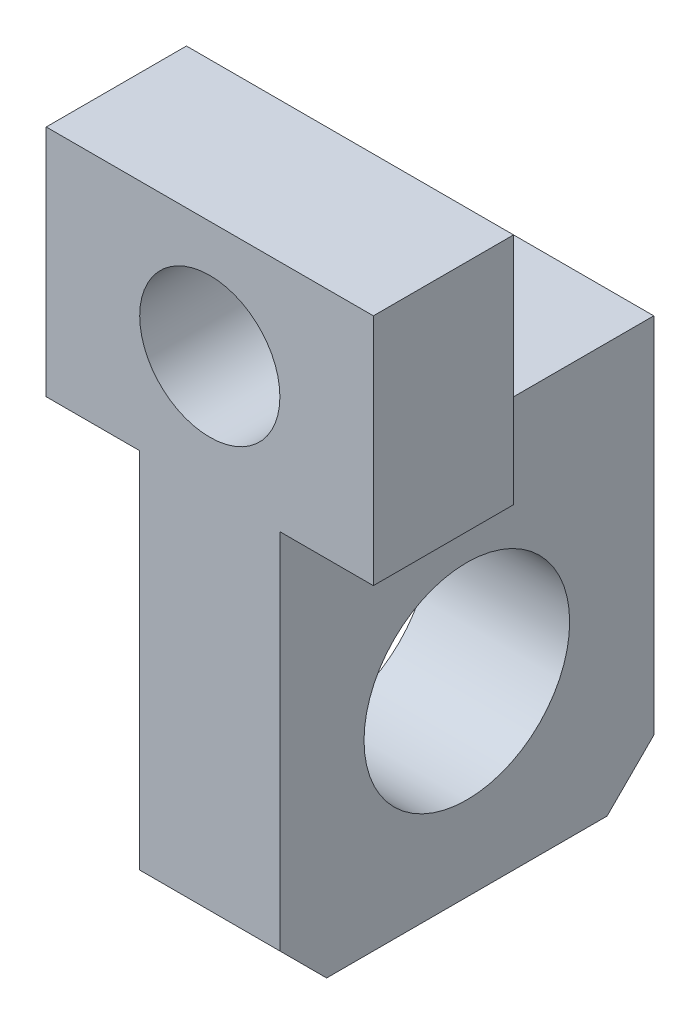
ISO-10303-21;
HEADER;
FILE_DESCRIPTION(('STEP AP214'),'2;1');
FILE_NAME('part.step','',(''),(''),'','','');
FILE_SCHEMA(('AUTOMOTIVE_DESIGN { 1 0 10303 214 1 1 1 1 }'));
ENDSEC;
DATA;
#1=APPLICATION_CONTEXT('core data for automotive mechanical design processes');
#2=APPLICATION_PROTOCOL_DEFINITION('international standard','automotive_design',2000,#1);
#3=PRODUCT_CONTEXT('',#1,'mechanical');
#4=PRODUCT('Part','Part','',(#3));
#5=PRODUCT_RELATED_PRODUCT_CATEGORY('part','',(#4));
#6=PRODUCT_DEFINITION_FORMATION('','',#4);
#7=PRODUCT_DEFINITION_CONTEXT('part definition',#1,'design');
#8=PRODUCT_DEFINITION('design','',#6,#7);
#9=PRODUCT_DEFINITION_SHAPE('','',#8);
#10=(LENGTH_UNIT() NAMED_UNIT(*) SI_UNIT(.MILLI.,.METRE.));
#11=(NAMED_UNIT(*) PLANE_ANGLE_UNIT() SI_UNIT($,.RADIAN.));
#12=(NAMED_UNIT(*) SI_UNIT($,.STERADIAN.) SOLID_ANGLE_UNIT());
#13=UNCERTAINTY_MEASURE_WITH_UNIT(LENGTH_MEASURE(1.E-05),#10,'distance_accuracy_value','');
#14=(GEOMETRIC_REPRESENTATION_CONTEXT(3) GLOBAL_UNCERTAINTY_ASSIGNED_CONTEXT((#13)) GLOBAL_UNIT_ASSIGNED_CONTEXT((#10,
#11,#12)) REPRESENTATION_CONTEXT('',''));
#15=CARTESIAN_POINT('',(0.,0.,0.));
#16=DIRECTION('',(0.,0.,1.));
#17=DIRECTION('',(1.,0.,0.));
#18=AXIS2_PLACEMENT_3D('',#15,#16,#17);
#19=CARTESIAN_POINT('',(0.,11.1387335246286,10.16));
#20=DIRECTION('',(0.,1.,0.));
#21=DIRECTION('',(0.,0.,1.));
#22=AXIS2_PLACEMENT_3D('',#19,#20,#21);
#23=PLANE('',#22);
#24=DIRECTION('',(-1.,0.,0.));
#25=VECTOR('',#24,1.);
#26=CARTESIAN_POINT('',(-6.35,11.1387335246286,6.35));
#27=LINE('',#26,#25);
#28=CARTESIAN_POINT('',(2.54,11.1387335246286,6.35));
#29=VERTEX_POINT('',#28);
#30=CARTESIAN_POINT('',(0.,11.1387335246286,6.35));
#31=VERTEX_POINT('',#30);
#32=EDGE_CURVE('E260',#29,#31,#27,.T.);
#33=ORIENTED_EDGE('',*,*,#32,.F.);
#34=DIRECTION('',(0.,0.,-1.));
#35=VECTOR('',#34,1.);
#36=CARTESIAN_POINT('',(2.54,11.1387335246286,10.16));
#37=LINE('',#36,#35);
#38=CARTESIAN_POINT('',(2.54,11.1387335246286,10.16));
#39=VERTEX_POINT('',#38);
#40=EDGE_CURVE('E167',#39,#29,#37,.T.);
#41=ORIENTED_EDGE('',*,*,#40,.F.);
#42=DIRECTION('',(1.,0.,0.));
#43=VECTOR('',#42,1.);
#44=CARTESIAN_POINT('',(0.,11.1387335246286,10.16));
#45=LINE('',#44,#43);
#46=CARTESIAN_POINT('',(0.,11.1387335246286,10.16));
#47=VERTEX_POINT('',#46);
#48=EDGE_CURVE('E287',#47,#39,#45,.T.);
#49=ORIENTED_EDGE('',*,*,#48,.F.);
#50=DIRECTION('',(0.,0.,-1.));
#51=VECTOR('',#50,1.);
#52=CARTESIAN_POINT('',(0.,11.1387335246286,10.16));
#53=LINE('',#52,#51);
#54=EDGE_CURVE('E176',#47,#31,#53,.T.);
#55=ORIENTED_EDGE('',*,*,#54,.T.);
#56=EDGE_LOOP('',(#33,#41,#49,#55));
#57=FACE_BOUND('',#56,.T.);
#58=ADVANCED_FACE('F47',(#57),#23,.F.);
#59=CARTESIAN_POINT('',(2.54,11.1387335246286,10.16));
#60=DIRECTION('',(-1.,0.,0.));
#61=DIRECTION('',(0.,-1.,0.));
#62=AXIS2_PLACEMENT_3D('',#59,#60,#61);
#63=PLANE('',#62);
#64=DIRECTION('',(0.,-1.,0.));
#65=VECTOR('',#64,1.);
#66=CARTESIAN_POINT('',(2.54,11.1387335246286,6.35));
#67=LINE('',#66,#65);
#68=CARTESIAN_POINT('',(2.54,17.4887335246286,6.35));
#69=VERTEX_POINT('',#68);
#70=EDGE_CURVE('E158',#69,#29,#67,.T.);
#71=ORIENTED_EDGE('',*,*,#70,.F.);
#72=DIRECTION('',(0.,0.,-1.));
#73=VECTOR('',#72,1.);
#74=CARTESIAN_POINT('',(2.54,17.4887335246286,10.16));
#75=LINE('',#74,#73);
#76=CARTESIAN_POINT('',(2.54,17.4887335246286,10.16));
#77=VERTEX_POINT('',#76);
#78=EDGE_CURVE('E156',#77,#69,#75,.T.);
#79=ORIENTED_EDGE('',*,*,#78,.F.);
#80=DIRECTION('',(0.,1.,0.));
#81=VECTOR('',#80,1.);
#82=CARTESIAN_POINT('',(2.54,11.1387335246286,10.16));
#83=LINE('',#82,#81);
#84=EDGE_CURVE('E290',#39,#77,#83,.T.);
#85=ORIENTED_EDGE('',*,*,#84,.F.);
#86=ORIENTED_EDGE('',*,*,#40,.T.);
#87=EDGE_LOOP('',(#71,#79,#85,#86));
#88=FACE_BOUND('',#87,.T.);
#89=ADVANCED_FACE('F302',(#88),#63,.F.);
#90=CARTESIAN_POINT('',(2.54,17.4887335246286,10.16));
#91=DIRECTION('',(0.,-1.,0.));
#92=DIRECTION('',(0.,0.,-1.));
#93=AXIS2_PLACEMENT_3D('',#90,#91,#92);
#94=PLANE('',#93);
#95=DIRECTION('',(1.,0.,0.));
#96=VECTOR('',#95,1.);
#97=CARTESIAN_POINT('',(-6.35,17.4887335246286,6.35));
#98=LINE('',#97,#96);
#99=CARTESIAN_POINT('',(-6.35,17.4887335246286,6.35));
#100=VERTEX_POINT('',#99);
#101=EDGE_CURVE('E136',#100,#69,#98,.T.);
#102=ORIENTED_EDGE('',*,*,#101,.F.);
#103=DIRECTION('',(0.,0.,-1.));
#104=VECTOR('',#103,1.);
#105=CARTESIAN_POINT('',(-6.35,17.4887335246286,10.16));
#106=LINE('',#105,#104);
#107=CARTESIAN_POINT('',(-6.35,17.4887335246286,10.16));
#108=VERTEX_POINT('',#107);
#109=EDGE_CURVE('E153',#108,#100,#106,.T.);
#110=ORIENTED_EDGE('',*,*,#109,.F.);
#111=DIRECTION('',(-1.,0.,0.));
#112=VECTOR('',#111,1.);
#113=CARTESIAN_POINT('',(2.54,17.4887335246286,10.16));
#114=LINE('',#113,#112);
#115=EDGE_CURVE('E293',#77,#108,#114,.T.);
#116=ORIENTED_EDGE('',*,*,#115,.F.);
#117=ORIENTED_EDGE('',*,*,#78,.T.);
#118=EDGE_LOOP('',(#102,#110,#116,#117));
#119=FACE_BOUND('',#118,.T.);
#120=ADVANCED_FACE('F151',(#119),#94,.F.);
#121=CARTESIAN_POINT('',(-6.35,17.4887335246286,10.16));
#122=DIRECTION('',(1.,0.,0.));
#123=DIRECTION('',(0.,0.,-1.));
#124=AXIS2_PLACEMENT_3D('',#121,#122,#123);
#125=PLANE('',#124);
#126=DIRECTION('',(0.,1.,0.));
#127=VECTOR('',#126,1.);
#128=CARTESIAN_POINT('',(-6.35,11.1387335246286,6.35));
#129=LINE('',#128,#127);
#130=CARTESIAN_POINT('',(-6.35,11.1387335246286,6.35));
#131=VERTEX_POINT('',#130);
#132=EDGE_CURVE('E133',#131,#100,#129,.T.);
#133=ORIENTED_EDGE('',*,*,#132,.F.);
#134=DIRECTION('',(0.,0.,-1.));
#135=VECTOR('',#134,1.);
#136=CARTESIAN_POINT('',(-6.35,11.1387335246286,10.16));
#137=LINE('',#136,#135);
#138=CARTESIAN_POINT('',(-6.35,11.1387335246286,10.16));
#139=VERTEX_POINT('',#138);
#140=EDGE_CURVE('E163',#139,#131,#137,.T.);
#141=ORIENTED_EDGE('',*,*,#140,.F.);
#142=DIRECTION('',(0.,-1.,0.));
#143=VECTOR('',#142,1.);
#144=CARTESIAN_POINT('',(-6.35,17.4887335246286,10.16));
#145=LINE('',#144,#143);
#146=EDGE_CURVE('E161',#108,#139,#145,.T.);
#147=ORIENTED_EDGE('',*,*,#146,.F.);
#148=ORIENTED_EDGE('',*,*,#109,.T.);
#149=EDGE_LOOP('',(#133,#141,#147,#148));
#150=FACE_BOUND('',#149,.T.);
#151=ADVANCED_FACE('F160',(#150),#125,.F.);
#152=CARTESIAN_POINT('',(-6.35,11.1387335246286,10.16));
#153=DIRECTION('',(0.,1.,0.));
#154=DIRECTION('',(0.,0.,1.));
#155=AXIS2_PLACEMENT_3D('',#152,#153,#154);
#156=PLANE('',#155);
#157=CARTESIAN_POINT('',(-3.81,11.1387335246286,6.35));
#158=VERTEX_POINT('',#157);
#159=EDGE_CURVE('E140',#158,#131,#27,.T.);
#160=ORIENTED_EDGE('',*,*,#159,.F.);
#161=DIRECTION('',(0.,0.,-1.));
#162=VECTOR('',#161,1.);
#163=CARTESIAN_POINT('',(-3.81,11.1387335246286,10.16));
#164=LINE('',#163,#162);
#165=CARTESIAN_POINT('',(-3.81,11.1387335246286,10.16));
#166=VERTEX_POINT('',#165);
#167=EDGE_CURVE('E169',#166,#158,#164,.T.);
#168=ORIENTED_EDGE('',*,*,#167,.F.);
#169=DIRECTION('',(1.,0.,0.));
#170=VECTOR('',#169,1.);
#171=CARTESIAN_POINT('',(-6.35,11.1387335246286,10.16));
#172=LINE('',#171,#170);
#173=EDGE_CURVE('E219',#139,#166,#172,.T.);
#174=ORIENTED_EDGE('',*,*,#173,.F.);
#175=ORIENTED_EDGE('',*,*,#140,.T.);
#176=EDGE_LOOP('',(#160,#168,#174,#175));
#177=FACE_BOUND('',#176,.T.);
#178=ADVANCED_FACE('F264',(#177),#156,.F.);
#179=CARTESIAN_POINT('',(-1.905,14.3137335246286,10.16));
#180=DIRECTION('',(0.,0.,-1.));
#181=DIRECTION('',(-1.,0.,0.));
#182=AXIS2_PLACEMENT_3D('',#179,#180,#181);
#183=CYLINDRICAL_SURFACE('',#182,1.905);
#184=CARTESIAN_POINT('',(-1.905,14.3137335246286,10.16));
#185=DIRECTION('',(0.,0.,1.));
#186=DIRECTION('',(1.,0.,0.));
#187=AXIS2_PLACEMENT_3D('',#184,#185,#186);
#188=CIRCLE('',#187,1.905);
#189=CARTESIAN_POINT('',(0.,14.3137335246286,10.16));
#190=VERTEX_POINT('',#189);
#191=EDGE_CURVE('E240',#190,#190,#188,.T.);
#192=ORIENTED_EDGE('',*,*,#191,.T.);
#193=EDGE_LOOP('',(#192));
#194=FACE_BOUND('',#193,.T.);
#195=CARTESIAN_POINT('',(-1.905,14.3137335246286,6.35));
#196=DIRECTION('',(0.,0.,-1.));
#197=DIRECTION('',(-1.,0.,0.));
#198=AXIS2_PLACEMENT_3D('',#195,#196,#197);
#199=CIRCLE('',#198,1.905);
#200=CARTESIAN_POINT('',(-3.81,14.3137335246286,6.35));
#201=VERTEX_POINT('',#200);
#202=EDGE_CURVE('E52',#201,#201,#199,.T.);
#203=ORIENTED_EDGE('',*,*,#202,.T.);
#204=EDGE_LOOP('',(#203));
#205=FACE_BOUND('',#204,.T.);
#206=ADVANCED_FACE('F337',(#194,#205),#183,.F.);
#207=CARTESIAN_POINT('',(0.,0.,10.16));
#208=DIRECTION('',(0.,0.,-1.));
#209=DIRECTION('',(-1.,0.,0.));
#210=AXIS2_PLACEMENT_3D('',#207,#208,#209);
#211=PLANE('',#210);
#212=DIRECTION('',(0.,-1.,0.));
#213=VECTOR('',#212,1.);
#214=CARTESIAN_POINT('',(-3.81,0.,10.16));
#215=LINE('',#214,#213);
#216=CARTESIAN_POINT('',(-3.81,1.27,10.16));
#217=VERTEX_POINT('',#216);
#218=EDGE_CURVE('E209',#166,#217,#215,.T.);
#219=ORIENTED_EDGE('',*,*,#218,.T.);
#220=DIRECTION('',(1.,0.,0.));
#221=VECTOR('',#220,1.);
#222=CARTESIAN_POINT('',(0.,1.27,10.16));
#223=LINE('',#222,#221);
#224=CARTESIAN_POINT('',(0.,1.27,10.16));
#225=VERTEX_POINT('',#224);
#226=EDGE_CURVE('E184',#217,#225,#223,.T.);
#227=ORIENTED_EDGE('',*,*,#226,.T.);
#228=DIRECTION('',(0.,1.,0.));
#229=VECTOR('',#228,1.);
#230=CARTESIAN_POINT('',(0.,0.,10.16));
#231=LINE('',#230,#229);
#232=EDGE_CURVE('E228',#225,#47,#231,.T.);
#233=ORIENTED_EDGE('',*,*,#232,.T.);
#234=ORIENTED_EDGE('',*,*,#48,.T.);
#235=ORIENTED_EDGE('',*,*,#84,.T.);
#236=ORIENTED_EDGE('',*,*,#115,.T.);
#237=ORIENTED_EDGE('',*,*,#146,.T.);
#238=ORIENTED_EDGE('',*,*,#173,.T.);
#239=EDGE_LOOP('',(#219,#227,#233,#234,#235,#236,#237,#238));
#240=FACE_BOUND('',#239,.T.);
#241=ORIENTED_EDGE('',*,*,#191,.F.);
#242=EDGE_LOOP('',(#241));
#243=FACE_BOUND('',#242,.T.);
#244=ADVANCED_FACE('F215',(#240,#243),#211,.F.);
#245=CARTESIAN_POINT('',(0.,0.,0.));
#246=DIRECTION('',(0.,0.,-1.));
#247=DIRECTION('',(-1.,0.,0.));
#248=AXIS2_PLACEMENT_3D('',#245,#246,#247);
#249=PLANE('',#248);
#250=DIRECTION('',(-1.,0.,0.));
#251=VECTOR('',#250,1.);
#252=CARTESIAN_POINT('',(-6.35,11.1387335246286,0.));
#253=LINE('',#252,#251);
#254=CARTESIAN_POINT('',(0.,11.1387335246286,0.));
#255=VERTEX_POINT('',#254);
#256=CARTESIAN_POINT('',(-3.81,11.1387335246286,0.));
#257=VERTEX_POINT('',#256);
#258=EDGE_CURVE('E146',#255,#257,#253,.T.);
#259=ORIENTED_EDGE('',*,*,#258,.F.);
#260=DIRECTION('',(0.,1.,0.));
#261=VECTOR('',#260,1.);
#262=CARTESIAN_POINT('',(0.,0.,0.));
#263=LINE('',#262,#261);
#264=CARTESIAN_POINT('',(0.,1.27,0.));
#265=VERTEX_POINT('',#264);
#266=EDGE_CURVE('E235',#265,#255,#263,.T.);
#267=ORIENTED_EDGE('',*,*,#266,.F.);
#268=DIRECTION('',(-1.,0.,0.));
#269=VECTOR('',#268,1.);
#270=CARTESIAN_POINT('',(-3.81,1.27,0.));
#271=LINE('',#270,#269);
#272=CARTESIAN_POINT('',(-3.81,1.27,0.));
#273=VERTEX_POINT('',#272);
#274=EDGE_CURVE('E11',#265,#273,#271,.T.);
#275=ORIENTED_EDGE('',*,*,#274,.T.);
#276=DIRECTION('',(0.,-1.,0.));
#277=VECTOR('',#276,1.);
#278=CARTESIAN_POINT('',(-3.81,0.,0.));
#279=LINE('',#278,#277);
#280=EDGE_CURVE('E239',#257,#273,#279,.T.);
#281=ORIENTED_EDGE('',*,*,#280,.F.);
#282=EDGE_LOOP('',(#259,#267,#275,#281));
#283=FACE_BOUND('',#282,.T.);
#284=ADVANCED_FACE('F237',(#283),#249,.T.);
#285=CARTESIAN_POINT('',(0.,0.,10.16));
#286=DIRECTION('',(0.,1.,0.));
#287=DIRECTION('',(0.,0.,1.));
#288=AXIS2_PLACEMENT_3D('',#285,#286,#287);
#289=PLANE('',#288);
#290=DIRECTION('',(0.,0.,-1.));
#291=VECTOR('',#290,1.);
#292=CARTESIAN_POINT('',(0.,0.,10.16));
#293=LINE('',#292,#291);
#294=CARTESIAN_POINT('',(0.,0.,8.89));
#295=VERTEX_POINT('',#294);
#296=CARTESIAN_POINT('',(0.,0.,1.27));
#297=VERTEX_POINT('',#296);
#298=EDGE_CURVE('E180',#295,#297,#293,.T.);
#299=ORIENTED_EDGE('',*,*,#298,.F.);
#300=DIRECTION('',(-1.,0.,0.));
#301=VECTOR('',#300,1.);
#302=CARTESIAN_POINT('',(0.,0.,8.89));
#303=LINE('',#302,#301);
#304=CARTESIAN_POINT('',(-3.81,0.,8.89));
#305=VERTEX_POINT('',#304);
#306=EDGE_CURVE('E198',#295,#305,#303,.T.);
#307=ORIENTED_EDGE('',*,*,#306,.T.);
#308=DIRECTION('',(0.,0.,-1.));
#309=VECTOR('',#308,1.);
#310=CARTESIAN_POINT('',(-3.81,0.,10.16));
#311=LINE('',#310,#309);
#312=CARTESIAN_POINT('',(-3.81,0.,1.27));
#313=VERTEX_POINT('',#312);
#314=EDGE_CURVE('E210',#305,#313,#311,.T.);
#315=ORIENTED_EDGE('',*,*,#314,.T.);
#316=DIRECTION('',(1.,0.,0.));
#317=VECTOR('',#316,1.);
#318=CARTESIAN_POINT('',(0.,0.,1.27));
#319=LINE('',#318,#317);
#320=EDGE_CURVE('E194',#313,#297,#319,.T.);
#321=ORIENTED_EDGE('',*,*,#320,.T.);
#322=EDGE_LOOP('',(#299,#307,#315,#321));
#323=FACE_BOUND('',#322,.T.);
#324=ADVANCED_FACE('F230',(#323),#289,.F.);
#325=CARTESIAN_POINT('',(0.,0.,10.16));
#326=DIRECTION('',(-1.,0.,0.));
#327=DIRECTION('',(0.,0.,1.));
#328=AXIS2_PLACEMENT_3D('',#325,#326,#327);
#329=PLANE('',#328);
#330=CARTESIAN_POINT('',(0.,5.08,5.08));
#331=DIRECTION('',(1.,0.,0.));
#332=DIRECTION('',(0.,0.,-1.));
#333=AXIS2_PLACEMENT_3D('',#330,#331,#332);
#334=CIRCLE('',#333,2.794);
#335=CARTESIAN_POINT('',(0.,5.08,2.286));
#336=VERTEX_POINT('',#335);
#337=EDGE_CURVE('E276',#336,#336,#334,.T.);
#338=ORIENTED_EDGE('',*,*,#337,.F.);
#339=EDGE_LOOP('',(#338));
#340=FACE_BOUND('',#339,.T.);
#341=ORIENTED_EDGE('',*,*,#232,.F.);
#342=DIRECTION('',(0.,0.707106781186546,0.707106781186549));
#343=VECTOR('',#342,1.);
#344=CARTESIAN_POINT('',(0.,1.27,10.16));
#345=LINE('',#344,#343);
#346=EDGE_CURVE('E191',#225,#295,#345,.F.);
#347=ORIENTED_EDGE('',*,*,#346,.T.);
#348=ORIENTED_EDGE('',*,*,#298,.T.);
#349=DIRECTION('',(0.,0.707106781186549,-0.707106781186546));
#350=VECTOR('',#349,1.);
#351=CARTESIAN_POINT('',(0.,0.,1.27));
#352=LINE('',#351,#350);
#353=EDGE_CURVE('E188',#297,#265,#352,.T.);
#354=ORIENTED_EDGE('',*,*,#353,.T.);
#355=ORIENTED_EDGE('',*,*,#266,.T.);
#356=DIRECTION('',(0.,0.,1.));
#357=VECTOR('',#356,1.);
#358=CARTESIAN_POINT('',(0.,11.1387335246286,10.16));
#359=LINE('',#358,#357);
#360=EDGE_CURVE('E272',#255,#31,#359,.T.);
#361=ORIENTED_EDGE('',*,*,#360,.T.);
#362=ORIENTED_EDGE('',*,*,#54,.F.);
#363=EDGE_LOOP('',(#341,#347,#348,#354,#355,#361,#362));
#364=FACE_BOUND('',#363,.T.);
#365=ADVANCED_FACE('F226',(#340,#364),#329,.F.);
#366=CARTESIAN_POINT('',(-3.81,0.,10.16));
#367=DIRECTION('',(1.,0.,0.));
#368=DIRECTION('',(0.,0.,-1.));
#369=AXIS2_PLACEMENT_3D('',#366,#367,#368);
#370=PLANE('',#369);
#371=CARTESIAN_POINT('',(-3.81,5.08,5.08));
#372=DIRECTION('',(1.,0.,0.));
#373=DIRECTION('',(0.,0.,-1.));
#374=AXIS2_PLACEMENT_3D('',#371,#372,#373);
#375=CIRCLE('',#374,2.794);
#376=CARTESIAN_POINT('',(-3.81,5.08,2.286));
#377=VERTEX_POINT('',#376);
#378=EDGE_CURVE('E246',#377,#377,#375,.F.);
#379=ORIENTED_EDGE('',*,*,#378,.F.);
#380=EDGE_LOOP('',(#379));
#381=FACE_BOUND('',#380,.T.);
#382=ORIENTED_EDGE('',*,*,#314,.F.);
#383=DIRECTION('',(0.,-0.707106781186546,-0.707106781186549));
#384=VECTOR('',#383,1.);
#385=CARTESIAN_POINT('',(-3.81,1.27,10.16));
#386=LINE('',#385,#384);
#387=EDGE_CURVE('E58',#305,#217,#386,.F.);
#388=ORIENTED_EDGE('',*,*,#387,.T.);
#389=ORIENTED_EDGE('',*,*,#218,.F.);
#390=ORIENTED_EDGE('',*,*,#167,.T.);
#391=EDGE_CURVE('E251',#158,#257,#164,.T.);
#392=ORIENTED_EDGE('',*,*,#391,.T.);
#393=ORIENTED_EDGE('',*,*,#280,.T.);
#394=DIRECTION('',(0.,-0.707106781186549,0.707106781186546));
#395=VECTOR('',#394,1.);
#396=CARTESIAN_POINT('',(-3.81,0.,1.27));
#397=LINE('',#396,#395);
#398=EDGE_CURVE('E70',#273,#313,#397,.T.);
#399=ORIENTED_EDGE('',*,*,#398,.T.);
#400=EDGE_LOOP('',(#382,#388,#389,#390,#392,#393,#399));
#401=FACE_BOUND('',#400,.T.);
#402=ADVANCED_FACE('F207',(#381,#401),#370,.F.);
#403=CARTESIAN_POINT('',(-6.351,5.08,5.08));
#404=DIRECTION('',(1.,0.,0.));
#405=DIRECTION('',(0.,0.,-1.));
#406=AXIS2_PLACEMENT_3D('',#403,#404,#405);
#407=CYLINDRICAL_SURFACE('',#406,2.794);
#408=ORIENTED_EDGE('',*,*,#337,.T.);
#409=EDGE_LOOP('',(#408));
#410=FACE_BOUND('',#409,.T.);
#411=ORIENTED_EDGE('',*,*,#378,.T.);
#412=EDGE_LOOP('',(#411));
#413=FACE_BOUND('',#412,.T.);
#414=ADVANCED_FACE('F321',(#410,#413),#407,.F.);
#415=CARTESIAN_POINT('',(0.,1.27,10.16));
#416=DIRECTION('',(0.,0.707106781186549,-0.707106781186546));
#417=DIRECTION('',(1.,0.,0.));
#418=AXIS2_PLACEMENT_3D('',#415,#416,#417);
#419=PLANE('',#418);
#420=ORIENTED_EDGE('',*,*,#387,.F.);
#421=ORIENTED_EDGE('',*,*,#306,.F.);
#422=ORIENTED_EDGE('',*,*,#346,.F.);
#423=ORIENTED_EDGE('',*,*,#226,.F.);
#424=EDGE_LOOP('',(#420,#421,#422,#423));
#425=FACE_BOUND('',#424,.T.);
#426=ADVANCED_FACE('F223',(#425),#419,.F.);
#427=CARTESIAN_POINT('',(0.,0.,1.27));
#428=DIRECTION('',(0.,-0.707106781186546,-0.707106781186549));
#429=DIRECTION('',(-1.,0.,0.));
#430=AXIS2_PLACEMENT_3D('',#427,#428,#429);
#431=PLANE('',#430);
#432=ORIENTED_EDGE('',*,*,#398,.F.);
#433=ORIENTED_EDGE('',*,*,#274,.F.);
#434=ORIENTED_EDGE('',*,*,#353,.F.);
#435=ORIENTED_EDGE('',*,*,#320,.F.);
#436=EDGE_LOOP('',(#432,#433,#434,#435));
#437=FACE_BOUND('',#436,.T.);
#438=ADVANCED_FACE('F50',(#437),#431,.T.);
#439=CARTESIAN_POINT('',(-6.35,11.1387335246286,6.35));
#440=DIRECTION('',(0.,-1.,0.));
#441=DIRECTION('',(0.,0.,-1.));
#442=AXIS2_PLACEMENT_3D('',#439,#440,#441);
#443=PLANE('',#442);
#444=ORIENTED_EDGE('',*,*,#258,.T.);
#445=ORIENTED_EDGE('',*,*,#391,.F.);
#446=EDGE_CURVE('E257',#31,#158,#27,.T.);
#447=ORIENTED_EDGE('',*,*,#446,.F.);
#448=ORIENTED_EDGE('',*,*,#360,.F.);
#449=EDGE_LOOP('',(#444,#445,#447,#448));
#450=FACE_BOUND('',#449,.T.);
#451=ADVANCED_FACE('F256',(#450),#443,.F.);
#452=CARTESIAN_POINT('',(0.,0.,6.35));
#453=DIRECTION('',(0.,0.,-1.));
#454=DIRECTION('',(-1.,0.,0.));
#455=AXIS2_PLACEMENT_3D('',#452,#453,#454);
#456=PLANE('',#455);
#457=ORIENTED_EDGE('',*,*,#202,.F.);
#458=EDGE_LOOP('',(#457));
#459=FACE_BOUND('',#458,.T.);
#460=ORIENTED_EDGE('',*,*,#132,.T.);
#461=ORIENTED_EDGE('',*,*,#101,.T.);
#462=ORIENTED_EDGE('',*,*,#70,.T.);
#463=ORIENTED_EDGE('',*,*,#32,.T.);
#464=ORIENTED_EDGE('',*,*,#446,.T.);
#465=ORIENTED_EDGE('',*,*,#159,.T.);
#466=EDGE_LOOP('',(#460,#461,#462,#463,#464,#465));
#467=FACE_BOUND('',#466,.T.);
#468=ADVANCED_FACE('F135',(#459,#467),#456,.T.);
#469=CLOSED_SHELL('',(#58,#89,#120,#151,#178,#206,#244,#284,#324,#365,#402,#414,#426,#438,#451,#468));
#470=MANIFOLD_SOLID_BREP('B2',#469);
#471=ADVANCED_BREP_SHAPE_REPRESENTATION('',(#18,#470),#14);
#472=SHAPE_DEFINITION_REPRESENTATION(#9,#471);
ENDSEC;
END-ISO-10303-21;
